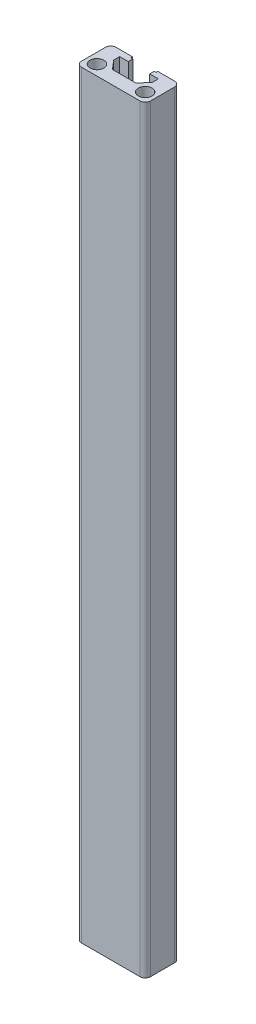
ISO-10303-21;
HEADER;
FILE_DESCRIPTION(('STEP AP214'),'2;1');
FILE_NAME('part.step','',(''),(''),'','','');
FILE_SCHEMA(('AUTOMOTIVE_DESIGN { 1 0 10303 214 1 1 1 1 }'));
ENDSEC;
DATA;
#1=APPLICATION_CONTEXT('core data for automotive mechanical design processes');
#2=APPLICATION_PROTOCOL_DEFINITION('international standard','automotive_design',2000,#1);
#3=PRODUCT_CONTEXT('',#1,'mechanical');
#4=PRODUCT('Part','Part','',(#3));
#5=PRODUCT_RELATED_PRODUCT_CATEGORY('part','',(#4));
#6=PRODUCT_DEFINITION_FORMATION('','',#4);
#7=PRODUCT_DEFINITION_CONTEXT('part definition',#1,'design');
#8=PRODUCT_DEFINITION('design','',#6,#7);
#9=PRODUCT_DEFINITION_SHAPE('','',#8);
#10=(LENGTH_UNIT() NAMED_UNIT(*) SI_UNIT(.MILLI.,.METRE.));
#11=(NAMED_UNIT(*) PLANE_ANGLE_UNIT() SI_UNIT($,.RADIAN.));
#12=(NAMED_UNIT(*) SI_UNIT($,.STERADIAN.) SOLID_ANGLE_UNIT());
#13=UNCERTAINTY_MEASURE_WITH_UNIT(LENGTH_MEASURE(1.E-05),#10,'distance_accuracy_value','');
#14=(GEOMETRIC_REPRESENTATION_CONTEXT(3) GLOBAL_UNCERTAINTY_ASSIGNED_CONTEXT((#13)) GLOBAL_UNIT_ASSIGNED_CONTEXT((#10,
#11,#12)) REPRESENTATION_CONTEXT('',''));
#15=CARTESIAN_POINT('',(0.,0.,0.));
#16=DIRECTION('',(0.,0.,1.));
#17=DIRECTION('',(1.,0.,0.));
#18=AXIS2_PLACEMENT_3D('',#15,#16,#17);
#19=CARTESIAN_POINT('',(0.,220.,0.));
#20=DIRECTION('',(0.,1.,0.));
#21=DIRECTION('',(0.,0.,1.));
#22=AXIS2_PLACEMENT_3D('',#19,#20,#21);
#23=PLANE('',#22);
#24=CARTESIAN_POINT('',(17.,220.,-3.));
#25=DIRECTION('',(0.,1.,0.));
#26=DIRECTION('',(0.,0.,1.));
#27=AXIS2_PLACEMENT_3D('',#24,#25,#26);
#28=CIRCLE('',#27,2.);
#29=CARTESIAN_POINT('',(17.,220.,-0.999999999999997));
#30=VERTEX_POINT('',#29);
#31=EDGE_CURVE('E262',#30,#30,#28,.T.);
#32=ORIENTED_EDGE('',*,*,#31,.F.);
#33=EDGE_LOOP('',(#32));
#34=FACE_BOUND('',#33,.T.);
#35=DIRECTION('',(-1.,0.,0.));
#36=VECTOR('',#35,1.);
#37=CARTESIAN_POINT('',(6.35,220.,-10.));
#38=LINE('',#37,#36);
#39=CARTESIAN_POINT('',(6.35,220.,-10.));
#40=VERTEX_POINT('',#39);
#41=CARTESIAN_POINT('',(1.5,220.,-10.));
#42=VERTEX_POINT('',#41);
#43=EDGE_CURVE('E253',#40,#42,#38,.T.);
#44=ORIENTED_EDGE('',*,*,#43,.T.);
#45=CARTESIAN_POINT('',(1.5,220.,-8.5));
#46=DIRECTION('',(0.,1.,0.));
#47=DIRECTION('',(0.,0.,1.));
#48=AXIS2_PLACEMENT_3D('',#45,#46,#47);
#49=CIRCLE('',#48,1.5);
#50=CARTESIAN_POINT('',(0.,220.,-8.5));
#51=VERTEX_POINT('',#50);
#52=EDGE_CURVE('E393',#42,#51,#49,.T.);
#53=ORIENTED_EDGE('',*,*,#52,.T.);
#54=DIRECTION('',(0.,0.,1.));
#55=VECTOR('',#54,1.);
#56=CARTESIAN_POINT('',(0.,220.,-10.));
#57=LINE('',#56,#55);
#58=CARTESIAN_POINT('',(0.,220.,-1.5));
#59=VERTEX_POINT('',#58);
#60=EDGE_CURVE('E314',#51,#59,#57,.T.);
#61=ORIENTED_EDGE('',*,*,#60,.T.);
#62=CARTESIAN_POINT('',(1.5,220.,-1.5));
#63=DIRECTION('',(0.,1.,0.));
#64=DIRECTION('',(0.,0.,1.));
#65=AXIS2_PLACEMENT_3D('',#62,#63,#64);
#66=CIRCLE('',#65,1.5);
#67=CARTESIAN_POINT('',(1.5,220.,0.));
#68=VERTEX_POINT('',#67);
#69=EDGE_CURVE('E390',#59,#68,#66,.T.);
#70=ORIENTED_EDGE('',*,*,#69,.T.);
#71=DIRECTION('',(1.,0.,0.));
#72=VECTOR('',#71,1.);
#73=CARTESIAN_POINT('',(0.,220.,0.));
#74=LINE('',#73,#72);
#75=CARTESIAN_POINT('',(18.5,220.,0.));
#76=VERTEX_POINT('',#75);
#77=EDGE_CURVE('E522',#68,#76,#74,.T.);
#78=ORIENTED_EDGE('',*,*,#77,.T.);
#79=CARTESIAN_POINT('',(18.5,220.,-1.5));
#80=DIRECTION('',(0.,1.,0.));
#81=DIRECTION('',(0.,0.,1.));
#82=AXIS2_PLACEMENT_3D('',#79,#80,#81);
#83=CIRCLE('',#82,1.5);
#84=CARTESIAN_POINT('',(20.,220.,-1.5));
#85=VERTEX_POINT('',#84);
#86=EDGE_CURVE('E385',#76,#85,#83,.T.);
#87=ORIENTED_EDGE('',*,*,#86,.T.);
#88=DIRECTION('',(0.,0.,-1.));
#89=VECTOR('',#88,1.);
#90=CARTESIAN_POINT('',(20.,220.,0.));
#91=LINE('',#90,#89);
#92=CARTESIAN_POINT('',(20.,220.,-8.5));
#93=VERTEX_POINT('',#92);
#94=EDGE_CURVE('E197',#85,#93,#91,.T.);
#95=ORIENTED_EDGE('',*,*,#94,.T.);
#96=CARTESIAN_POINT('',(18.5,220.,-8.5));
#97=DIRECTION('',(0.,1.,0.));
#98=DIRECTION('',(0.,0.,1.));
#99=AXIS2_PLACEMENT_3D('',#96,#97,#98);
#100=CIRCLE('',#99,1.5);
#101=CARTESIAN_POINT('',(18.5,220.,-10.));
#102=VERTEX_POINT('',#101);
#103=EDGE_CURVE('E55',#93,#102,#100,.T.);
#104=ORIENTED_EDGE('',*,*,#103,.T.);
#105=DIRECTION('',(-1.,0.,0.));
#106=VECTOR('',#105,1.);
#107=CARTESIAN_POINT('',(20.,220.,-10.));
#108=LINE('',#107,#106);
#109=CARTESIAN_POINT('',(13.65,220.,-10.));
#110=VERTEX_POINT('',#109);
#111=EDGE_CURVE('E186',#102,#110,#108,.T.);
#112=ORIENTED_EDGE('',*,*,#111,.T.);
#113=DIRECTION('',(0.,0.,1.));
#114=VECTOR('',#113,1.);
#115=CARTESIAN_POINT('',(13.65,220.,-9.51042760217637));
#116=LINE('',#115,#114);
#117=CARTESIAN_POINT('',(13.65,220.,-9.51042760217637));
#118=VERTEX_POINT('',#117);
#119=EDGE_CURVE('E191',#110,#118,#116,.T.);
#120=ORIENTED_EDGE('',*,*,#119,.T.);
#121=DIRECTION('',(-1.,0.,0.));
#122=VECTOR('',#121,1.);
#123=CARTESIAN_POINT('',(13.1,220.,-9.51042760217637));
#124=LINE('',#123,#122);
#125=CARTESIAN_POINT('',(13.1,220.,-9.51042760217637));
#126=VERTEX_POINT('',#125);
#127=EDGE_CURVE('E214',#118,#126,#124,.T.);
#128=ORIENTED_EDGE('',*,*,#127,.T.);
#129=DIRECTION('',(0.,0.,1.));
#130=VECTOR('',#129,1.);
#131=CARTESIAN_POINT('',(13.1,220.,-8.2));
#132=LINE('',#131,#130);
#133=CARTESIAN_POINT('',(13.1,220.,-8.2));
#134=VERTEX_POINT('',#133);
#135=EDGE_CURVE('E217',#126,#134,#132,.T.);
#136=ORIENTED_EDGE('',*,*,#135,.T.);
#137=DIRECTION('',(1.,0.,0.));
#138=VECTOR('',#137,1.);
#139=CARTESIAN_POINT('',(15.6,220.,-8.2));
#140=LINE('',#139,#138);
#141=CARTESIAN_POINT('',(15.6,220.,-8.2));
#142=VERTEX_POINT('',#141);
#143=EDGE_CURVE('E223',#134,#142,#140,.T.);
#144=ORIENTED_EDGE('',*,*,#143,.T.);
#145=DIRECTION('',(0.,0.,1.));
#146=VECTOR('',#145,1.);
#147=CARTESIAN_POINT('',(15.6,220.,-6.44750713590306));
#148=LINE('',#147,#146);
#149=CARTESIAN_POINT('',(15.6,220.,-6.44750713590306));
#150=VERTEX_POINT('',#149);
#151=EDGE_CURVE('E226',#142,#150,#148,.T.);
#152=ORIENTED_EDGE('',*,*,#151,.T.);
#153=DIRECTION('',(-0.651429062487269,0.,0.758709546893248));
#154=VECTOR('',#153,1.);
#155=CARTESIAN_POINT('',(13.4127068625717,220.,-3.9));
#156=LINE('',#155,#154);
#157=CARTESIAN_POINT('',(13.4127068625717,220.,-3.9));
#158=VERTEX_POINT('',#157);
#159=EDGE_CURVE('E229',#150,#158,#156,.T.);
#160=ORIENTED_EDGE('',*,*,#159,.T.);
#161=DIRECTION('',(-1.,0.,0.));
#162=VECTOR('',#161,1.);
#163=CARTESIAN_POINT('',(6.58729313742833,220.,-3.9));
#164=LINE('',#163,#162);
#165=CARTESIAN_POINT('',(6.58729313742833,220.,-3.9));
#166=VERTEX_POINT('',#165);
#167=EDGE_CURVE('E232',#158,#166,#164,.T.);
#168=ORIENTED_EDGE('',*,*,#167,.T.);
#169=DIRECTION('',(-0.651429062487269,0.,-0.758709546893248));
#170=VECTOR('',#169,1.);
#171=CARTESIAN_POINT('',(4.4,220.,-6.44750713590306));
#172=LINE('',#171,#170);
#173=CARTESIAN_POINT('',(4.4,220.,-6.44750713590306));
#174=VERTEX_POINT('',#173);
#175=EDGE_CURVE('E235',#166,#174,#172,.T.);
#176=ORIENTED_EDGE('',*,*,#175,.T.);
#177=DIRECTION('',(0.,0.,-1.));
#178=VECTOR('',#177,1.);
#179=CARTESIAN_POINT('',(4.4,220.,-8.2));
#180=LINE('',#179,#178);
#181=CARTESIAN_POINT('',(4.4,220.,-8.2));
#182=VERTEX_POINT('',#181);
#183=EDGE_CURVE('E238',#174,#182,#180,.T.);
#184=ORIENTED_EDGE('',*,*,#183,.T.);
#185=DIRECTION('',(1.,0.,0.));
#186=VECTOR('',#185,1.);
#187=CARTESIAN_POINT('',(6.9,220.,-8.2));
#188=LINE('',#187,#186);
#189=CARTESIAN_POINT('',(6.9,220.,-8.2));
#190=VERTEX_POINT('',#189);
#191=EDGE_CURVE('E241',#182,#190,#188,.T.);
#192=ORIENTED_EDGE('',*,*,#191,.T.);
#193=DIRECTION('',(0.,0.,-1.));
#194=VECTOR('',#193,1.);
#195=CARTESIAN_POINT('',(6.9,220.,-9.51042760217637));
#196=LINE('',#195,#194);
#197=CARTESIAN_POINT('',(6.9,220.,-9.51042760217637));
#198=VERTEX_POINT('',#197);
#199=EDGE_CURVE('E244',#190,#198,#196,.T.);
#200=ORIENTED_EDGE('',*,*,#199,.T.);
#201=DIRECTION('',(-1.,0.,0.));
#202=VECTOR('',#201,1.);
#203=CARTESIAN_POINT('',(6.35,220.,-9.51042760217637));
#204=LINE('',#203,#202);
#205=CARTESIAN_POINT('',(6.35,220.,-9.51042760217637));
#206=VERTEX_POINT('',#205);
#207=EDGE_CURVE('E247',#198,#206,#204,.T.);
#208=ORIENTED_EDGE('',*,*,#207,.T.);
#209=DIRECTION('',(0.,0.,-1.));
#210=VECTOR('',#209,1.);
#211=CARTESIAN_POINT('',(6.35,220.,-10.));
#212=LINE('',#211,#210);
#213=EDGE_CURVE('E250',#206,#40,#212,.T.);
#214=ORIENTED_EDGE('',*,*,#213,.T.);
#215=EDGE_LOOP('',(#44,#53,#61,#70,#78,#87,#95,#104,#112,#120,#128,#136,#144,#152,#160,#168,
#176,#184,#192,#200,#208,#214));
#216=FACE_BOUND('',#215,.T.);
#217=CARTESIAN_POINT('',(3.,220.,-3.));
#218=DIRECTION('',(0.,1.,0.));
#219=DIRECTION('',(0.,0.,1.));
#220=AXIS2_PLACEMENT_3D('',#217,#218,#219);
#221=CIRCLE('',#220,2.);
#222=CARTESIAN_POINT('',(3.,220.,-1.));
#223=VERTEX_POINT('',#222);
#224=EDGE_CURVE('E572',#223,#223,#221,.T.);
#225=ORIENTED_EDGE('',*,*,#224,.F.);
#226=EDGE_LOOP('',(#225));
#227=FACE_BOUND('',#226,.T.);
#228=ADVANCED_FACE('F39',(#34,#216,#227),#23,.T.);
#229=CARTESIAN_POINT('',(0.,0.,0.));
#230=DIRECTION('',(0.,1.,0.));
#231=DIRECTION('',(0.,0.,1.));
#232=AXIS2_PLACEMENT_3D('',#229,#230,#231);
#233=PLANE('',#232);
#234=DIRECTION('',(0.,0.,1.));
#235=VECTOR('',#234,1.);
#236=CARTESIAN_POINT('',(0.,0.,-10.));
#237=LINE('',#236,#235);
#238=CARTESIAN_POINT('',(0.,0.,-8.5));
#239=VERTEX_POINT('',#238);
#240=CARTESIAN_POINT('',(0.,0.,-1.5));
#241=VERTEX_POINT('',#240);
#242=EDGE_CURVE('E257',#239,#241,#237,.T.);
#243=ORIENTED_EDGE('',*,*,#242,.F.);
#244=CARTESIAN_POINT('',(1.5,0.,-8.5));
#245=DIRECTION('',(0.,1.,0.));
#246=DIRECTION('',(0.,0.,1.));
#247=AXIS2_PLACEMENT_3D('',#244,#245,#246);
#248=CIRCLE('',#247,1.5);
#249=CARTESIAN_POINT('',(1.5,0.,-10.));
#250=VERTEX_POINT('',#249);
#251=EDGE_CURVE('E379',#239,#250,#248,.F.);
#252=ORIENTED_EDGE('',*,*,#251,.T.);
#253=DIRECTION('',(-1.,0.,0.));
#254=VECTOR('',#253,1.);
#255=CARTESIAN_POINT('',(6.35,0.,-10.));
#256=LINE('',#255,#254);
#257=CARTESIAN_POINT('',(6.35,0.,-10.));
#258=VERTEX_POINT('',#257);
#259=EDGE_CURVE('E310',#258,#250,#256,.T.);
#260=ORIENTED_EDGE('',*,*,#259,.F.);
#261=DIRECTION('',(0.,0.,-1.));
#262=VECTOR('',#261,1.);
#263=CARTESIAN_POINT('',(6.35,0.,-10.));
#264=LINE('',#263,#262);
#265=CARTESIAN_POINT('',(6.35,0.,-9.51042760217637));
#266=VERTEX_POINT('',#265);
#267=EDGE_CURVE('E307',#266,#258,#264,.T.);
#268=ORIENTED_EDGE('',*,*,#267,.F.);
#269=DIRECTION('',(-1.,0.,0.));
#270=VECTOR('',#269,1.);
#271=CARTESIAN_POINT('',(6.35,0.,-9.51042760217637));
#272=LINE('',#271,#270);
#273=CARTESIAN_POINT('',(6.9,0.,-9.51042760217637));
#274=VERTEX_POINT('',#273);
#275=EDGE_CURVE('E304',#274,#266,#272,.T.);
#276=ORIENTED_EDGE('',*,*,#275,.F.);
#277=DIRECTION('',(0.,0.,-1.));
#278=VECTOR('',#277,1.);
#279=CARTESIAN_POINT('',(6.9,0.,-9.51042760217637));
#280=LINE('',#279,#278);
#281=CARTESIAN_POINT('',(6.9,0.,-8.2));
#282=VERTEX_POINT('',#281);
#283=EDGE_CURVE('E301',#282,#274,#280,.T.);
#284=ORIENTED_EDGE('',*,*,#283,.F.);
#285=DIRECTION('',(1.,0.,0.));
#286=VECTOR('',#285,1.);
#287=CARTESIAN_POINT('',(6.9,0.,-8.2));
#288=LINE('',#287,#286);
#289=CARTESIAN_POINT('',(4.4,0.,-8.2));
#290=VERTEX_POINT('',#289);
#291=EDGE_CURVE('E298',#290,#282,#288,.T.);
#292=ORIENTED_EDGE('',*,*,#291,.F.);
#293=DIRECTION('',(0.,0.,-1.));
#294=VECTOR('',#293,1.);
#295=CARTESIAN_POINT('',(4.4,0.,-8.2));
#296=LINE('',#295,#294);
#297=CARTESIAN_POINT('',(4.4,0.,-6.44750713590306));
#298=VERTEX_POINT('',#297);
#299=EDGE_CURVE('E295',#298,#290,#296,.T.);
#300=ORIENTED_EDGE('',*,*,#299,.F.);
#301=DIRECTION('',(-0.651429062487269,0.,-0.758709546893248));
#302=VECTOR('',#301,1.);
#303=CARTESIAN_POINT('',(4.4,0.,-6.44750713590306));
#304=LINE('',#303,#302);
#305=CARTESIAN_POINT('',(6.58729313742833,0.,-3.9));
#306=VERTEX_POINT('',#305);
#307=EDGE_CURVE('E292',#306,#298,#304,.T.);
#308=ORIENTED_EDGE('',*,*,#307,.F.);
#309=DIRECTION('',(-1.,0.,0.));
#310=VECTOR('',#309,1.);
#311=CARTESIAN_POINT('',(6.58729313742833,0.,-3.9));
#312=LINE('',#311,#310);
#313=CARTESIAN_POINT('',(13.4127068625717,0.,-3.9));
#314=VERTEX_POINT('',#313);
#315=EDGE_CURVE('E289',#314,#306,#312,.T.);
#316=ORIENTED_EDGE('',*,*,#315,.F.);
#317=DIRECTION('',(-0.651429062487269,0.,0.758709546893248));
#318=VECTOR('',#317,1.);
#319=CARTESIAN_POINT('',(13.4127068625717,0.,-3.9));
#320=LINE('',#319,#318);
#321=CARTESIAN_POINT('',(15.6,0.,-6.44750713590306));
#322=VERTEX_POINT('',#321);
#323=EDGE_CURVE('E286',#322,#314,#320,.T.);
#324=ORIENTED_EDGE('',*,*,#323,.F.);
#325=DIRECTION('',(0.,0.,1.));
#326=VECTOR('',#325,1.);
#327=CARTESIAN_POINT('',(15.6,0.,-6.44750713590306));
#328=LINE('',#327,#326);
#329=CARTESIAN_POINT('',(15.6,0.,-8.2));
#330=VERTEX_POINT('',#329);
#331=EDGE_CURVE('E283',#330,#322,#328,.T.);
#332=ORIENTED_EDGE('',*,*,#331,.F.);
#333=DIRECTION('',(1.,0.,0.));
#334=VECTOR('',#333,1.);
#335=CARTESIAN_POINT('',(15.6,0.,-8.2));
#336=LINE('',#335,#334);
#337=CARTESIAN_POINT('',(13.1,0.,-8.2));
#338=VERTEX_POINT('',#337);
#339=EDGE_CURVE('E280',#338,#330,#336,.T.);
#340=ORIENTED_EDGE('',*,*,#339,.F.);
#341=DIRECTION('',(0.,0.,1.));
#342=VECTOR('',#341,1.);
#343=CARTESIAN_POINT('',(13.1,0.,-8.2));
#344=LINE('',#343,#342);
#345=CARTESIAN_POINT('',(13.1,0.,-9.51042760217637));
#346=VERTEX_POINT('',#345);
#347=EDGE_CURVE('E277',#346,#338,#344,.T.);
#348=ORIENTED_EDGE('',*,*,#347,.F.);
#349=DIRECTION('',(-1.,0.,0.));
#350=VECTOR('',#349,1.);
#351=CARTESIAN_POINT('',(13.1,0.,-9.51042760217637));
#352=LINE('',#351,#350);
#353=CARTESIAN_POINT('',(13.65,0.,-9.51042760217637));
#354=VERTEX_POINT('',#353);
#355=EDGE_CURVE('E274',#354,#346,#352,.T.);
#356=ORIENTED_EDGE('',*,*,#355,.F.);
#357=DIRECTION('',(0.,0.,1.));
#358=VECTOR('',#357,1.);
#359=CARTESIAN_POINT('',(13.65,0.,-9.51042760217637));
#360=LINE('',#359,#358);
#361=CARTESIAN_POINT('',(13.65,0.,-10.));
#362=VERTEX_POINT('',#361);
#363=EDGE_CURVE('E271',#362,#354,#360,.T.);
#364=ORIENTED_EDGE('',*,*,#363,.F.);
#365=DIRECTION('',(-1.,0.,0.));
#366=VECTOR('',#365,1.);
#367=CARTESIAN_POINT('',(20.,0.,-10.));
#368=LINE('',#367,#366);
#369=CARTESIAN_POINT('',(18.5,0.,-10.));
#370=VERTEX_POINT('',#369);
#371=EDGE_CURVE('E203',#370,#362,#368,.T.);
#372=ORIENTED_EDGE('',*,*,#371,.F.);
#373=CARTESIAN_POINT('',(18.5,0.,-8.5));
#374=DIRECTION('',(0.,1.,0.));
#375=DIRECTION('',(0.,0.,1.));
#376=AXIS2_PLACEMENT_3D('',#373,#374,#375);
#377=CIRCLE('',#376,1.5);
#378=CARTESIAN_POINT('',(20.,0.,-8.5));
#379=VERTEX_POINT('',#378);
#380=EDGE_CURVE('E373',#370,#379,#377,.F.);
#381=ORIENTED_EDGE('',*,*,#380,.T.);
#382=DIRECTION('',(0.,0.,-1.));
#383=VECTOR('',#382,1.);
#384=CARTESIAN_POINT('',(20.,0.,0.));
#385=LINE('',#384,#383);
#386=CARTESIAN_POINT('',(20.,0.,-1.5));
#387=VERTEX_POINT('',#386);
#388=EDGE_CURVE('E266',#387,#379,#385,.T.);
#389=ORIENTED_EDGE('',*,*,#388,.F.);
#390=CARTESIAN_POINT('',(18.5,0.,-1.5));
#391=DIRECTION('',(0.,1.,0.));
#392=DIRECTION('',(0.,0.,1.));
#393=AXIS2_PLACEMENT_3D('',#390,#391,#392);
#394=CIRCLE('',#393,1.5);
#395=CARTESIAN_POINT('',(18.5,0.,0.));
#396=VERTEX_POINT('',#395);
#397=EDGE_CURVE('E370',#387,#396,#394,.F.);
#398=ORIENTED_EDGE('',*,*,#397,.T.);
#399=DIRECTION('',(1.,0.,0.));
#400=VECTOR('',#399,1.);
#401=CARTESIAN_POINT('',(0.,0.,0.));
#402=LINE('',#401,#400);
#403=CARTESIAN_POINT('',(1.5,0.,0.));
#404=VERTEX_POINT('',#403);
#405=EDGE_CURVE('E261',#404,#396,#402,.T.);
#406=ORIENTED_EDGE('',*,*,#405,.F.);
#407=CARTESIAN_POINT('',(1.5,0.,-1.5));
#408=DIRECTION('',(0.,1.,0.));
#409=DIRECTION('',(0.,0.,1.));
#410=AXIS2_PLACEMENT_3D('',#407,#408,#409);
#411=CIRCLE('',#410,1.5);
#412=EDGE_CURVE('E376',#404,#241,#411,.F.);
#413=ORIENTED_EDGE('',*,*,#412,.T.);
#414=EDGE_LOOP('',(#243,#252,#260,#268,#276,#284,#292,#300,#308,#316,#324,#332,#340,#348,#356,
#364,#372,#381,#389,#398,#406,#413));
#415=FACE_BOUND('',#414,.T.);
#416=CARTESIAN_POINT('',(17.,0.,-3.));
#417=DIRECTION('',(0.,1.,0.));
#418=DIRECTION('',(0.,0.,1.));
#419=AXIS2_PLACEMENT_3D('',#416,#417,#418);
#420=CIRCLE('',#419,2.);
#421=CARTESIAN_POINT('',(17.,0.,-0.999999999999997));
#422=VERTEX_POINT('',#421);
#423=EDGE_CURVE('E528',#422,#422,#420,.T.);
#424=ORIENTED_EDGE('',*,*,#423,.T.);
#425=EDGE_LOOP('',(#424));
#426=FACE_BOUND('',#425,.T.);
#427=CARTESIAN_POINT('',(3.,0.,-3.));
#428=DIRECTION('',(0.,1.,0.));
#429=DIRECTION('',(0.,0.,1.));
#430=AXIS2_PLACEMENT_3D('',#427,#428,#429);
#431=CIRCLE('',#430,2.);
#432=CARTESIAN_POINT('',(3.,0.,-1.));
#433=VERTEX_POINT('',#432);
#434=EDGE_CURVE('E576',#433,#433,#431,.T.);
#435=ORIENTED_EDGE('',*,*,#434,.T.);
#436=EDGE_LOOP('',(#435));
#437=FACE_BOUND('',#436,.T.);
#438=ADVANCED_FACE('F414',(#415,#426,#437),#233,.F.);
#439=CARTESIAN_POINT('',(0.,220.,-10.));
#440=DIRECTION('',(1.,0.,0.));
#441=DIRECTION('',(0.,0.,-1.));
#442=AXIS2_PLACEMENT_3D('',#439,#440,#441);
#443=PLANE('',#442);
#444=ORIENTED_EDGE('',*,*,#60,.F.);
#445=DIRECTION('',(0.,-1.,0.));
#446=VECTOR('',#445,1.);
#447=CARTESIAN_POINT('',(0.,220.,-8.5));
#448=LINE('',#447,#446);
#449=EDGE_CURVE('E366',#51,#239,#448,.T.);
#450=ORIENTED_EDGE('',*,*,#449,.T.);
#451=ORIENTED_EDGE('',*,*,#242,.T.);
#452=DIRECTION('',(0.,-1.,0.));
#453=VECTOR('',#452,1.);
#454=CARTESIAN_POINT('',(0.,220.,-1.5));
#455=LINE('',#454,#453);
#456=EDGE_CURVE('E207',#241,#59,#455,.F.);
#457=ORIENTED_EDGE('',*,*,#456,.T.);
#458=EDGE_LOOP('',(#444,#450,#451,#457));
#459=FACE_BOUND('',#458,.T.);
#460=ADVANCED_FACE('F434',(#459),#443,.F.);
#461=CARTESIAN_POINT('',(0.,220.,0.));
#462=DIRECTION('',(0.,0.,-1.));
#463=DIRECTION('',(-1.,0.,0.));
#464=AXIS2_PLACEMENT_3D('',#461,#462,#463);
#465=PLANE('',#464);
#466=ORIENTED_EDGE('',*,*,#77,.F.);
#467=DIRECTION('',(0.,-1.,0.));
#468=VECTOR('',#467,1.);
#469=CARTESIAN_POINT('',(1.5,220.,0.));
#470=LINE('',#469,#468);
#471=EDGE_CURVE('E399',#68,#404,#470,.T.);
#472=ORIENTED_EDGE('',*,*,#471,.T.);
#473=ORIENTED_EDGE('',*,*,#405,.T.);
#474=DIRECTION('',(0.,-1.,0.));
#475=VECTOR('',#474,1.);
#476=CARTESIAN_POINT('',(18.5,220.,0.));
#477=LINE('',#476,#475);
#478=EDGE_CURVE('E396',#396,#76,#477,.F.);
#479=ORIENTED_EDGE('',*,*,#478,.T.);
#480=EDGE_LOOP('',(#466,#472,#473,#479));
#481=FACE_BOUND('',#480,.T.);
#482=ADVANCED_FACE('F499',(#481),#465,.F.);
#483=CARTESIAN_POINT('',(20.,220.,0.));
#484=DIRECTION('',(-1.,0.,0.));
#485=DIRECTION('',(0.,0.,1.));
#486=AXIS2_PLACEMENT_3D('',#483,#484,#485);
#487=PLANE('',#486);
#488=ORIENTED_EDGE('',*,*,#388,.T.);
#489=DIRECTION('',(0.,-1.,0.));
#490=VECTOR('',#489,1.);
#491=CARTESIAN_POINT('',(20.,220.,-8.5));
#492=LINE('',#491,#490);
#493=EDGE_CURVE('E11',#379,#93,#492,.F.);
#494=ORIENTED_EDGE('',*,*,#493,.T.);
#495=ORIENTED_EDGE('',*,*,#94,.F.);
#496=DIRECTION('',(0.,-1.,0.));
#497=VECTOR('',#496,1.);
#498=CARTESIAN_POINT('',(20.,220.,-1.5));
#499=LINE('',#498,#497);
#500=EDGE_CURVE('E48',#85,#387,#499,.T.);
#501=ORIENTED_EDGE('',*,*,#500,.T.);
#502=EDGE_LOOP('',(#488,#494,#495,#501));
#503=FACE_BOUND('',#502,.T.);
#504=ADVANCED_FACE('F409',(#503),#487,.F.);
#505=CARTESIAN_POINT('',(20.,220.,-10.));
#506=DIRECTION('',(0.,0.,1.));
#507=DIRECTION('',(1.,0.,0.));
#508=AXIS2_PLACEMENT_3D('',#505,#506,#507);
#509=PLANE('',#508);
#510=ORIENTED_EDGE('',*,*,#111,.F.);
#511=DIRECTION('',(0.,-1.,0.));
#512=VECTOR('',#511,1.);
#513=CARTESIAN_POINT('',(18.5,220.,-10.));
#514=LINE('',#513,#512);
#515=EDGE_CURVE('E403',#102,#370,#514,.T.);
#516=ORIENTED_EDGE('',*,*,#515,.T.);
#517=ORIENTED_EDGE('',*,*,#371,.T.);
#518=DIRECTION('',(0.,-1.,0.));
#519=VECTOR('',#518,1.);
#520=CARTESIAN_POINT('',(13.65,220.,-10.));
#521=LINE('',#520,#519);
#522=EDGE_CURVE('E200',#110,#362,#521,.T.);
#523=ORIENTED_EDGE('',*,*,#522,.F.);
#524=EDGE_LOOP('',(#510,#516,#517,#523));
#525=FACE_BOUND('',#524,.T.);
#526=ADVANCED_FACE('F201',(#525),#509,.F.);
#527=CARTESIAN_POINT('',(13.65,220.,-9.51042760217637));
#528=DIRECTION('',(1.,0.,0.));
#529=DIRECTION('',(0.,0.,-1.));
#530=AXIS2_PLACEMENT_3D('',#527,#528,#529);
#531=PLANE('',#530);
#532=ORIENTED_EDGE('',*,*,#363,.T.);
#533=DIRECTION('',(0.,-1.,0.));
#534=VECTOR('',#533,1.);
#535=CARTESIAN_POINT('',(13.65,220.,-9.51042760217637));
#536=LINE('',#535,#534);
#537=EDGE_CURVE('E208',#118,#354,#536,.T.);
#538=ORIENTED_EDGE('',*,*,#537,.F.);
#539=ORIENTED_EDGE('',*,*,#119,.F.);
#540=ORIENTED_EDGE('',*,*,#522,.T.);
#541=EDGE_LOOP('',(#532,#538,#539,#540));
#542=FACE_BOUND('',#541,.T.);
#543=ADVANCED_FACE('F210',(#542),#531,.F.);
#544=CARTESIAN_POINT('',(13.1,220.,-9.51042760217637));
#545=DIRECTION('',(0.,0.,1.));
#546=DIRECTION('',(1.,0.,0.));
#547=AXIS2_PLACEMENT_3D('',#544,#545,#546);
#548=PLANE('',#547);
#549=ORIENTED_EDGE('',*,*,#355,.T.);
#550=DIRECTION('',(0.,-1.,0.));
#551=VECTOR('',#550,1.);
#552=CARTESIAN_POINT('',(13.1,220.,-9.51042760217637));
#553=LINE('',#552,#551);
#554=EDGE_CURVE('E358',#126,#346,#553,.T.);
#555=ORIENTED_EDGE('',*,*,#554,.F.);
#556=ORIENTED_EDGE('',*,*,#127,.F.);
#557=ORIENTED_EDGE('',*,*,#537,.T.);
#558=EDGE_LOOP('',(#549,#555,#556,#557));
#559=FACE_BOUND('',#558,.T.);
#560=ADVANCED_FACE('F488',(#559),#548,.F.);
#561=CARTESIAN_POINT('',(13.1,220.,-8.2));
#562=DIRECTION('',(1.,0.,0.));
#563=DIRECTION('',(0.,0.,-1.));
#564=AXIS2_PLACEMENT_3D('',#561,#562,#563);
#565=PLANE('',#564);
#566=ORIENTED_EDGE('',*,*,#347,.T.);
#567=DIRECTION('',(0.,-1.,0.));
#568=VECTOR('',#567,1.);
#569=CARTESIAN_POINT('',(13.1,220.,-8.2));
#570=LINE('',#569,#568);
#571=EDGE_CURVE('E354',#134,#338,#570,.T.);
#572=ORIENTED_EDGE('',*,*,#571,.F.);
#573=ORIENTED_EDGE('',*,*,#135,.F.);
#574=ORIENTED_EDGE('',*,*,#554,.T.);
#575=EDGE_LOOP('',(#566,#572,#573,#574));
#576=FACE_BOUND('',#575,.T.);
#577=ADVANCED_FACE('F484',(#576),#565,.F.);
#578=CARTESIAN_POINT('',(15.6,220.,-8.2));
#579=DIRECTION('',(0.,0.,-1.));
#580=DIRECTION('',(-1.,0.,0.));
#581=AXIS2_PLACEMENT_3D('',#578,#579,#580);
#582=PLANE('',#581);
#583=ORIENTED_EDGE('',*,*,#339,.T.);
#584=DIRECTION('',(0.,-1.,0.));
#585=VECTOR('',#584,1.);
#586=CARTESIAN_POINT('',(15.6,220.,-8.2));
#587=LINE('',#586,#585);
#588=EDGE_CURVE('E350',#142,#330,#587,.T.);
#589=ORIENTED_EDGE('',*,*,#588,.F.);
#590=ORIENTED_EDGE('',*,*,#143,.F.);
#591=ORIENTED_EDGE('',*,*,#571,.T.);
#592=EDGE_LOOP('',(#583,#589,#590,#591));
#593=FACE_BOUND('',#592,.T.);
#594=ADVANCED_FACE('F480',(#593),#582,.F.);
#595=CARTESIAN_POINT('',(15.6,220.,-6.44750713590306));
#596=DIRECTION('',(1.,0.,0.));
#597=DIRECTION('',(0.,0.,-1.));
#598=AXIS2_PLACEMENT_3D('',#595,#596,#597);
#599=PLANE('',#598);
#600=ORIENTED_EDGE('',*,*,#331,.T.);
#601=DIRECTION('',(0.,-1.,0.));
#602=VECTOR('',#601,1.);
#603=CARTESIAN_POINT('',(15.6,220.,-6.44750713590306));
#604=LINE('',#603,#602);
#605=EDGE_CURVE('E346',#150,#322,#604,.T.);
#606=ORIENTED_EDGE('',*,*,#605,.F.);
#607=ORIENTED_EDGE('',*,*,#151,.F.);
#608=ORIENTED_EDGE('',*,*,#588,.T.);
#609=EDGE_LOOP('',(#600,#606,#607,#608));
#610=FACE_BOUND('',#609,.T.);
#611=ADVANCED_FACE('F476',(#610),#599,.F.);
#612=CARTESIAN_POINT('',(13.4127068625717,220.,-3.9));
#613=DIRECTION('',(0.758709546893248,0.,0.651429062487269));
#614=DIRECTION('',(0.651429062487269,0.,-0.758709546893248));
#615=AXIS2_PLACEMENT_3D('',#612,#613,#614);
#616=PLANE('',#615);
#617=ORIENTED_EDGE('',*,*,#323,.T.);
#618=DIRECTION('',(0.,-1.,0.));
#619=VECTOR('',#618,1.);
#620=CARTESIAN_POINT('',(13.4127068625717,220.,-3.9));
#621=LINE('',#620,#619);
#622=EDGE_CURVE('E342',#158,#314,#621,.T.);
#623=ORIENTED_EDGE('',*,*,#622,.F.);
#624=ORIENTED_EDGE('',*,*,#159,.F.);
#625=ORIENTED_EDGE('',*,*,#605,.T.);
#626=EDGE_LOOP('',(#617,#623,#624,#625));
#627=FACE_BOUND('',#626,.T.);
#628=ADVANCED_FACE('F472',(#627),#616,.F.);
#629=CARTESIAN_POINT('',(6.58729313742833,220.,-3.9));
#630=DIRECTION('',(0.,0.,1.));
#631=DIRECTION('',(1.,0.,0.));
#632=AXIS2_PLACEMENT_3D('',#629,#630,#631);
#633=PLANE('',#632);
#634=ORIENTED_EDGE('',*,*,#315,.T.);
#635=DIRECTION('',(0.,-1.,0.));
#636=VECTOR('',#635,1.);
#637=CARTESIAN_POINT('',(6.58729313742833,220.,-3.9));
#638=LINE('',#637,#636);
#639=EDGE_CURVE('E338',#166,#306,#638,.T.);
#640=ORIENTED_EDGE('',*,*,#639,.F.);
#641=ORIENTED_EDGE('',*,*,#167,.F.);
#642=ORIENTED_EDGE('',*,*,#622,.T.);
#643=EDGE_LOOP('',(#634,#640,#641,#642));
#644=FACE_BOUND('',#643,.T.);
#645=ADVANCED_FACE('F468',(#644),#633,.F.);
#646=CARTESIAN_POINT('',(4.4,220.,-6.44750713590306));
#647=DIRECTION('',(-0.758709546893248,0.,0.651429062487269));
#648=DIRECTION('',(0.651429062487269,0.,0.758709546893248));
#649=AXIS2_PLACEMENT_3D('',#646,#647,#648);
#650=PLANE('',#649);
#651=ORIENTED_EDGE('',*,*,#307,.T.);
#652=DIRECTION('',(0.,-1.,0.));
#653=VECTOR('',#652,1.);
#654=CARTESIAN_POINT('',(4.4,220.,-6.44750713590306));
#655=LINE('',#654,#653);
#656=EDGE_CURVE('E334',#174,#298,#655,.T.);
#657=ORIENTED_EDGE('',*,*,#656,.F.);
#658=ORIENTED_EDGE('',*,*,#175,.F.);
#659=ORIENTED_EDGE('',*,*,#639,.T.);
#660=EDGE_LOOP('',(#651,#657,#658,#659));
#661=FACE_BOUND('',#660,.T.);
#662=ADVANCED_FACE('F464',(#661),#650,.F.);
#663=CARTESIAN_POINT('',(4.4,220.,-8.2));
#664=DIRECTION('',(-1.,0.,0.));
#665=DIRECTION('',(0.,0.,1.));
#666=AXIS2_PLACEMENT_3D('',#663,#664,#665);
#667=PLANE('',#666);
#668=ORIENTED_EDGE('',*,*,#299,.T.);
#669=DIRECTION('',(0.,-1.,0.));
#670=VECTOR('',#669,1.);
#671=CARTESIAN_POINT('',(4.4,220.,-8.2));
#672=LINE('',#671,#670);
#673=EDGE_CURVE('E330',#182,#290,#672,.T.);
#674=ORIENTED_EDGE('',*,*,#673,.F.);
#675=ORIENTED_EDGE('',*,*,#183,.F.);
#676=ORIENTED_EDGE('',*,*,#656,.T.);
#677=EDGE_LOOP('',(#668,#674,#675,#676));
#678=FACE_BOUND('',#677,.T.);
#679=ADVANCED_FACE('F460',(#678),#667,.F.);
#680=CARTESIAN_POINT('',(6.9,220.,-8.2));
#681=DIRECTION('',(0.,0.,-1.));
#682=DIRECTION('',(-1.,0.,0.));
#683=AXIS2_PLACEMENT_3D('',#680,#681,#682);
#684=PLANE('',#683);
#685=ORIENTED_EDGE('',*,*,#291,.T.);
#686=DIRECTION('',(0.,-1.,0.));
#687=VECTOR('',#686,1.);
#688=CARTESIAN_POINT('',(6.9,220.,-8.2));
#689=LINE('',#688,#687);
#690=EDGE_CURVE('E326',#190,#282,#689,.T.);
#691=ORIENTED_EDGE('',*,*,#690,.F.);
#692=ORIENTED_EDGE('',*,*,#191,.F.);
#693=ORIENTED_EDGE('',*,*,#673,.T.);
#694=EDGE_LOOP('',(#685,#691,#692,#693));
#695=FACE_BOUND('',#694,.T.);
#696=ADVANCED_FACE('F456',(#695),#684,.F.);
#697=CARTESIAN_POINT('',(6.9,220.,-9.51042760217637));
#698=DIRECTION('',(-1.,0.,0.));
#699=DIRECTION('',(0.,0.,1.));
#700=AXIS2_PLACEMENT_3D('',#697,#698,#699);
#701=PLANE('',#700);
#702=ORIENTED_EDGE('',*,*,#283,.T.);
#703=DIRECTION('',(0.,-1.,0.));
#704=VECTOR('',#703,1.);
#705=CARTESIAN_POINT('',(6.9,220.,-9.51042760217637));
#706=LINE('',#705,#704);
#707=EDGE_CURVE('E322',#198,#274,#706,.T.);
#708=ORIENTED_EDGE('',*,*,#707,.F.);
#709=ORIENTED_EDGE('',*,*,#199,.F.);
#710=ORIENTED_EDGE('',*,*,#690,.T.);
#711=EDGE_LOOP('',(#702,#708,#709,#710));
#712=FACE_BOUND('',#711,.T.);
#713=ADVANCED_FACE('F452',(#712),#701,.F.);
#714=CARTESIAN_POINT('',(6.35,220.,-9.51042760217637));
#715=DIRECTION('',(0.,0.,1.));
#716=DIRECTION('',(1.,0.,0.));
#717=AXIS2_PLACEMENT_3D('',#714,#715,#716);
#718=PLANE('',#717);
#719=ORIENTED_EDGE('',*,*,#275,.T.);
#720=DIRECTION('',(0.,-1.,0.));
#721=VECTOR('',#720,1.);
#722=CARTESIAN_POINT('',(6.35,220.,-9.51042760217637));
#723=LINE('',#722,#721);
#724=EDGE_CURVE('E318',#206,#266,#723,.T.);
#725=ORIENTED_EDGE('',*,*,#724,.F.);
#726=ORIENTED_EDGE('',*,*,#207,.F.);
#727=ORIENTED_EDGE('',*,*,#707,.T.);
#728=EDGE_LOOP('',(#719,#725,#726,#727));
#729=FACE_BOUND('',#728,.T.);
#730=ADVANCED_FACE('F448',(#729),#718,.F.);
#731=CARTESIAN_POINT('',(6.35,220.,-10.));
#732=DIRECTION('',(-1.,0.,0.));
#733=DIRECTION('',(0.,0.,1.));
#734=AXIS2_PLACEMENT_3D('',#731,#732,#733);
#735=PLANE('',#734);
#736=ORIENTED_EDGE('',*,*,#267,.T.);
#737=DIRECTION('',(0.,-1.,0.));
#738=VECTOR('',#737,1.);
#739=CARTESIAN_POINT('',(6.35,220.,-10.));
#740=LINE('',#739,#738);
#741=EDGE_CURVE('E256',#40,#258,#740,.T.);
#742=ORIENTED_EDGE('',*,*,#741,.F.);
#743=ORIENTED_EDGE('',*,*,#213,.F.);
#744=ORIENTED_EDGE('',*,*,#724,.T.);
#745=EDGE_LOOP('',(#736,#742,#743,#744));
#746=FACE_BOUND('',#745,.T.);
#747=ADVANCED_FACE('F444',(#746),#735,.F.);
#748=CARTESIAN_POINT('',(6.35,220.,-10.));
#749=DIRECTION('',(0.,0.,1.));
#750=DIRECTION('',(1.,0.,0.));
#751=AXIS2_PLACEMENT_3D('',#748,#749,#750);
#752=PLANE('',#751);
#753=ORIENTED_EDGE('',*,*,#259,.T.);
#754=DIRECTION('',(0.,-1.,0.));
#755=VECTOR('',#754,1.);
#756=CARTESIAN_POINT('',(1.5,220.,-10.));
#757=LINE('',#756,#755);
#758=EDGE_CURVE('E382',#250,#42,#757,.F.);
#759=ORIENTED_EDGE('',*,*,#758,.T.);
#760=ORIENTED_EDGE('',*,*,#43,.F.);
#761=ORIENTED_EDGE('',*,*,#741,.T.);
#762=EDGE_LOOP('',(#753,#759,#760,#761));
#763=FACE_BOUND('',#762,.T.);
#764=ADVANCED_FACE('F441',(#763),#752,.F.);
#765=CARTESIAN_POINT('',(17.,220.,-3.));
#766=DIRECTION('',(0.,-1.,0.));
#767=DIRECTION('',(0.,0.,-1.));
#768=AXIS2_PLACEMENT_3D('',#765,#766,#767);
#769=CYLINDRICAL_SURFACE('',#768,2.);
#770=ORIENTED_EDGE('',*,*,#31,.T.);
#771=EDGE_LOOP('',(#770));
#772=FACE_BOUND('',#771,.T.);
#773=ORIENTED_EDGE('',*,*,#423,.F.);
#774=EDGE_LOOP('',(#773));
#775=FACE_BOUND('',#774,.T.);
#776=ADVANCED_FACE('F438',(#772,#775),#769,.F.);
#777=CARTESIAN_POINT('',(3.,220.,-3.));
#778=DIRECTION('',(0.,-1.,0.));
#779=DIRECTION('',(0.,0.,-1.));
#780=AXIS2_PLACEMENT_3D('',#777,#778,#779);
#781=CYLINDRICAL_SURFACE('',#780,2.);
#782=ORIENTED_EDGE('',*,*,#224,.T.);
#783=EDGE_LOOP('',(#782));
#784=FACE_BOUND('',#783,.T.);
#785=ORIENTED_EDGE('',*,*,#434,.F.);
#786=EDGE_LOOP('',(#785));
#787=FACE_BOUND('',#786,.T.);
#788=ADVANCED_FACE('F507',(#784,#787),#781,.F.);
#789=CARTESIAN_POINT('',(1.5,220.,-8.5));
#790=DIRECTION('',(0.,-1.,0.));
#791=DIRECTION('',(0.,0.,-1.));
#792=AXIS2_PLACEMENT_3D('',#789,#790,#791);
#793=CYLINDRICAL_SURFACE('',#792,1.5);
#794=ORIENTED_EDGE('',*,*,#52,.F.);
#795=ORIENTED_EDGE('',*,*,#758,.F.);
#796=ORIENTED_EDGE('',*,*,#251,.F.);
#797=ORIENTED_EDGE('',*,*,#449,.F.);
#798=EDGE_LOOP('',(#794,#795,#796,#797));
#799=FACE_BOUND('',#798,.T.);
#800=ADVANCED_FACE('F425',(#799),#793,.T.);
#801=CARTESIAN_POINT('',(1.5,220.,-1.5));
#802=DIRECTION('',(0.,-1.,0.));
#803=DIRECTION('',(0.,0.,-1.));
#804=AXIS2_PLACEMENT_3D('',#801,#802,#803);
#805=CYLINDRICAL_SURFACE('',#804,1.5);
#806=ORIENTED_EDGE('',*,*,#69,.F.);
#807=ORIENTED_EDGE('',*,*,#456,.F.);
#808=ORIENTED_EDGE('',*,*,#412,.F.);
#809=ORIENTED_EDGE('',*,*,#471,.F.);
#810=EDGE_LOOP('',(#806,#807,#808,#809));
#811=FACE_BOUND('',#810,.T.);
#812=ADVANCED_FACE('F420',(#811),#805,.T.);
#813=CARTESIAN_POINT('',(18.5,220.,-8.5));
#814=DIRECTION('',(0.,-1.,0.));
#815=DIRECTION('',(0.,0.,-1.));
#816=AXIS2_PLACEMENT_3D('',#813,#814,#815);
#817=CYLINDRICAL_SURFACE('',#816,1.5);
#818=ORIENTED_EDGE('',*,*,#103,.F.);
#819=ORIENTED_EDGE('',*,*,#493,.F.);
#820=ORIENTED_EDGE('',*,*,#380,.F.);
#821=ORIENTED_EDGE('',*,*,#515,.F.);
#822=EDGE_LOOP('',(#818,#819,#820,#821));
#823=FACE_BOUND('',#822,.T.);
#824=ADVANCED_FACE('F418',(#823),#817,.T.);
#825=CARTESIAN_POINT('',(18.5,220.,-1.5));
#826=DIRECTION('',(0.,-1.,0.));
#827=DIRECTION('',(0.,0.,-1.));
#828=AXIS2_PLACEMENT_3D('',#825,#826,#827);
#829=CYLINDRICAL_SURFACE('',#828,1.5);
#830=ORIENTED_EDGE('',*,*,#86,.F.);
#831=ORIENTED_EDGE('',*,*,#478,.F.);
#832=ORIENTED_EDGE('',*,*,#397,.F.);
#833=ORIENTED_EDGE('',*,*,#500,.F.);
#834=EDGE_LOOP('',(#830,#831,#832,#833));
#835=FACE_BOUND('',#834,.T.);
#836=ADVANCED_FACE('F41',(#835),#829,.T.);
#837=CLOSED_SHELL('',(#228,#438,#460,#482,#504,#526,#543,#560,#577,#594,#611,#628,#645,#662,
#679,#696,#713,#730,#747,#764,#776,#788,#800,#812,#824,#836));
#838=MANIFOLD_SOLID_BREP('B2',#837);
#839=ADVANCED_BREP_SHAPE_REPRESENTATION('',(#18,#838),#14);
#840=SHAPE_DEFINITION_REPRESENTATION(#9,#839);
ENDSEC;
END-ISO-10303-21;
